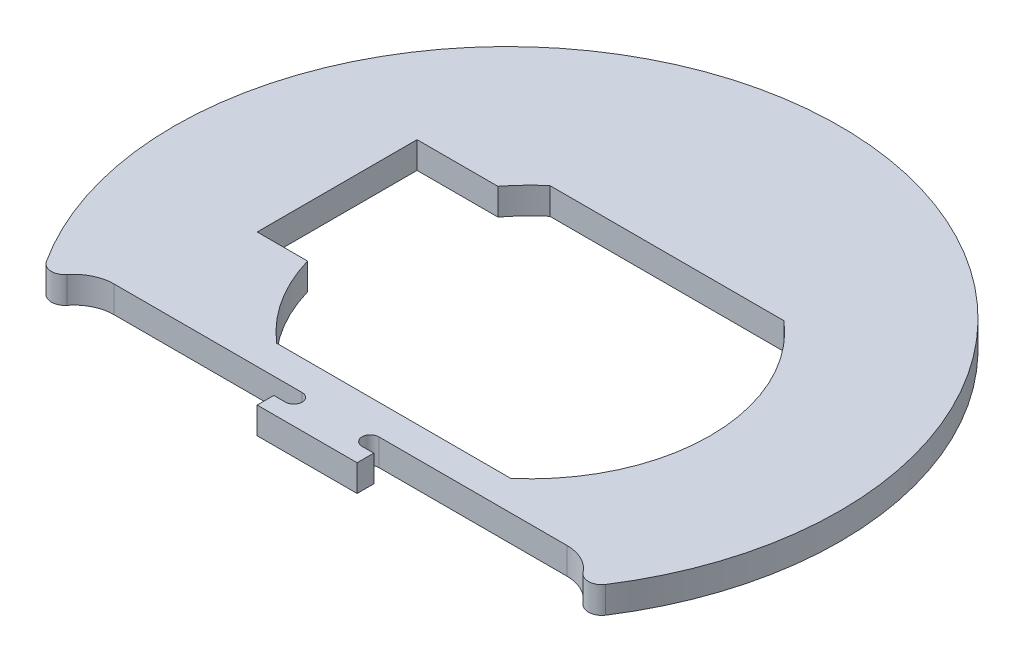
ISO-10303-21;
HEADER;
FILE_DESCRIPTION(('STEP AP214'),'2;1');
FILE_NAME('part.step','',(''),(''),'','','');
FILE_SCHEMA(('AUTOMOTIVE_DESIGN { 1 0 10303 214 1 1 1 1 }'));
ENDSEC;
DATA;
#1=APPLICATION_CONTEXT('core data for automotive mechanical design processes');
#2=APPLICATION_PROTOCOL_DEFINITION('international standard','automotive_design',2000,#1);
#3=PRODUCT_CONTEXT('',#1,'mechanical');
#4=PRODUCT('Part','Part','',(#3));
#5=PRODUCT_RELATED_PRODUCT_CATEGORY('part','',(#4));
#6=PRODUCT_DEFINITION_FORMATION('','',#4);
#7=PRODUCT_DEFINITION_CONTEXT('part definition',#1,'design');
#8=PRODUCT_DEFINITION('design','',#6,#7);
#9=PRODUCT_DEFINITION_SHAPE('','',#8);
#10=(LENGTH_UNIT() NAMED_UNIT(*) SI_UNIT(.MILLI.,.METRE.));
#11=(NAMED_UNIT(*) PLANE_ANGLE_UNIT() SI_UNIT($,.RADIAN.));
#12=(NAMED_UNIT(*) SI_UNIT($,.STERADIAN.) SOLID_ANGLE_UNIT());
#13=UNCERTAINTY_MEASURE_WITH_UNIT(LENGTH_MEASURE(1.E-05),#10,'distance_accuracy_value','');
#14=(GEOMETRIC_REPRESENTATION_CONTEXT(3) GLOBAL_UNCERTAINTY_ASSIGNED_CONTEXT((#13)) GLOBAL_UNIT_ASSIGNED_CONTEXT((#10,
#11,#12)) REPRESENTATION_CONTEXT('',''));
#15=CARTESIAN_POINT('',(0.,0.,0.));
#16=DIRECTION('',(0.,0.,1.));
#17=DIRECTION('',(1.,0.,0.));
#18=AXIS2_PLACEMENT_3D('',#15,#16,#17);
#19=CARTESIAN_POINT('',(5.75000000000001,2.,26.25));
#20=DIRECTION('',(0.,-1.,0.));
#21=DIRECTION('',(0.,0.,-1.));
#22=AXIS2_PLACEMENT_3D('',#19,#20,#21);
#23=PLANE('',#22);
#24=DIRECTION('',(0.,0.,-1.));
#25=VECTOR('',#24,1.);
#26=CARTESIAN_POINT('',(7.5,2.,30.));
#27=LINE('',#26,#25);
#28=CARTESIAN_POINT('',(7.5,2.,30.));
#29=VERTEX_POINT('',#28);
#30=CARTESIAN_POINT('',(7.5,2.,27.5));
#31=VERTEX_POINT('',#30);
#32=EDGE_CURVE('E278',#29,#31,#27,.T.);
#33=ORIENTED_EDGE('',*,*,#32,.T.);
#34=DIRECTION('',(-1.,0.,0.));
#35=VECTOR('',#34,1.);
#36=CARTESIAN_POINT('',(7.5,2.,27.5));
#37=LINE('',#36,#35);
#38=CARTESIAN_POINT('',(5.75000000000001,2.,27.5));
#39=VERTEX_POINT('',#38);
#40=EDGE_CURVE('E282',#31,#39,#37,.T.);
#41=ORIENTED_EDGE('',*,*,#40,.T.);
#42=CARTESIAN_POINT('',(5.75000000000001,2.,26.25));
#43=DIRECTION('',(0.,-1.,0.));
#44=DIRECTION('',(0.,0.,-1.));
#45=AXIS2_PLACEMENT_3D('',#42,#43,#44);
#46=CIRCLE('',#45,1.25);
#47=CARTESIAN_POINT('',(5.75000000000001,2.,25.));
#48=VERTEX_POINT('',#47);
#49=EDGE_CURVE('E286',#39,#48,#46,.T.);
#50=ORIENTED_EDGE('',*,*,#49,.T.);
#51=DIRECTION('',(1.,0.,0.));
#52=VECTOR('',#51,1.);
#53=CARTESIAN_POINT('',(5.75000000000001,2.,25.));
#54=LINE('',#53,#52);
#55=CARTESIAN_POINT('',(34.,2.,25.));
#56=VERTEX_POINT('',#55);
#57=EDGE_CURVE('E289',#48,#56,#54,.T.);
#58=ORIENTED_EDGE('',*,*,#57,.T.);
#59=CARTESIAN_POINT('',(34.,2.,31.));
#60=DIRECTION('',(0.,-1.,0.));
#61=DIRECTION('',(0.,0.,-1.));
#62=AXIS2_PLACEMENT_3D('',#59,#60,#61);
#63=CIRCLE('',#62,6.);
#64=CARTESIAN_POINT('',(38.7264875714163,2.,27.3040136313499));
#65=VERTEX_POINT('',#64);
#66=EDGE_CURVE('E292',#56,#65,#63,.T.);
#67=ORIENTED_EDGE('',*,*,#66,.T.);
#68=CARTESIAN_POINT('',(40.3019834285551,2.,26.0720181751332));
#69=DIRECTION('',(0.,1.,0.));
#70=DIRECTION('',(0.,0.,1.));
#71=AXIS2_PLACEMENT_3D('',#68,#69,#70);
#72=CIRCLE('',#71,2.);
#73=CARTESIAN_POINT('',(41.9812327380782,2.,27.1583522657637));
#74=VERTEX_POINT('',#73);
#75=EDGE_CURVE('E295',#65,#74,#72,.T.);
#76=ORIENTED_EDGE('',*,*,#75,.T.);
#77=CARTESIAN_POINT('',(0.,2.,0.));
#78=DIRECTION('',(0.,1.,0.));
#79=DIRECTION('',(0.,0.,1.));
#80=AXIS2_PLACEMENT_3D('',#77,#78,#79);
#81=CIRCLE('',#80,50.);
#82=CARTESIAN_POINT('',(-41.9812327380782,2.,27.1583522657637));
#83=VERTEX_POINT('',#82);
#84=EDGE_CURVE('E298',#74,#83,#81,.T.);
#85=ORIENTED_EDGE('',*,*,#84,.T.);
#86=CARTESIAN_POINT('',(-40.3019834285551,2.,26.0720181751332));
#87=DIRECTION('',(0.,1.,0.));
#88=DIRECTION('',(0.,0.,-1.));
#89=AXIS2_PLACEMENT_3D('',#86,#87,#88);
#90=CIRCLE('',#89,2.);
#91=CARTESIAN_POINT('',(-38.7264875714163,2.,27.3040136313499));
#92=VERTEX_POINT('',#91);
#93=EDGE_CURVE('E301',#83,#92,#90,.T.);
#94=ORIENTED_EDGE('',*,*,#93,.T.);
#95=CARTESIAN_POINT('',(-34.,2.,31.));
#96=DIRECTION('',(0.,-1.,0.));
#97=DIRECTION('',(0.,0.,1.));
#98=AXIS2_PLACEMENT_3D('',#95,#96,#97);
#99=CIRCLE('',#98,6.);
#100=CARTESIAN_POINT('',(-34.,2.,25.));
#101=VERTEX_POINT('',#100);
#102=EDGE_CURVE('E304',#92,#101,#99,.T.);
#103=ORIENTED_EDGE('',*,*,#102,.T.);
#104=DIRECTION('',(1.,0.,0.));
#105=VECTOR('',#104,1.);
#106=CARTESIAN_POINT('',(-5.75,2.,25.));
#107=LINE('',#106,#105);
#108=CARTESIAN_POINT('',(-5.75,2.,25.));
#109=VERTEX_POINT('',#108);
#110=EDGE_CURVE('E307',#101,#109,#107,.T.);
#111=ORIENTED_EDGE('',*,*,#110,.T.);
#112=CARTESIAN_POINT('',(-5.75,2.,26.25));
#113=DIRECTION('',(0.,-1.,0.));
#114=DIRECTION('',(0.,0.,1.));
#115=AXIS2_PLACEMENT_3D('',#112,#113,#114);
#116=CIRCLE('',#115,1.25);
#117=CARTESIAN_POINT('',(-5.75,2.,27.5));
#118=VERTEX_POINT('',#117);
#119=EDGE_CURVE('E310',#109,#118,#116,.T.);
#120=ORIENTED_EDGE('',*,*,#119,.T.);
#121=DIRECTION('',(-1.,0.,0.));
#122=VECTOR('',#121,1.);
#123=CARTESIAN_POINT('',(-7.49999999999999,2.,27.5));
#124=LINE('',#123,#122);
#125=CARTESIAN_POINT('',(-7.49999999999999,2.,27.5));
#126=VERTEX_POINT('',#125);
#127=EDGE_CURVE('E313',#118,#126,#124,.T.);
#128=ORIENTED_EDGE('',*,*,#127,.T.);
#129=DIRECTION('',(0.,0.,1.));
#130=VECTOR('',#129,1.);
#131=CARTESIAN_POINT('',(-7.5,2.,30.));
#132=LINE('',#131,#130);
#133=CARTESIAN_POINT('',(-7.5,2.,30.));
#134=VERTEX_POINT('',#133);
#135=EDGE_CURVE('E316',#126,#134,#132,.T.);
#136=ORIENTED_EDGE('',*,*,#135,.T.);
#137=DIRECTION('',(1.,0.,0.));
#138=VECTOR('',#137,1.);
#139=CARTESIAN_POINT('',(7.5,2.,30.));
#140=LINE('',#139,#138);
#141=EDGE_CURVE('E319',#134,#29,#140,.T.);
#142=ORIENTED_EDGE('',*,*,#141,.T.);
#143=EDGE_LOOP('',(#33,#41,#50,#58,#67,#76,#85,#94,#103,#111,#120,#128,#136,#142));
#144=FACE_BOUND('',#143,.T.);
#145=CARTESIAN_POINT('',(3.5,2.,0.));
#146=DIRECTION('',(0.,1.,0.));
#147=DIRECTION('',(0.,0.,1.));
#148=AXIS2_PLACEMENT_3D('',#145,#146,#147);
#149=CIRCLE('',#148,27.);
#150=CARTESIAN_POINT('',(-22.4374246986859,2.,7.5));
#151=VERTEX_POINT('',#150);
#152=CARTESIAN_POINT('',(-14.0712833908056,2.,20.5));
#153=VERTEX_POINT('',#152);
#154=EDGE_CURVE('E189',#151,#153,#149,.T.);
#155=ORIENTED_EDGE('',*,*,#154,.F.);
#156=DIRECTION('',(1.,0.,0.));
#157=VECTOR('',#156,1.);
#158=CARTESIAN_POINT('',(-30.,2.,7.5));
#159=LINE('',#158,#157);
#160=CARTESIAN_POINT('',(-30.,2.,7.5));
#161=VERTEX_POINT('',#160);
#162=EDGE_CURVE('E230',#161,#151,#159,.T.);
#163=ORIENTED_EDGE('',*,*,#162,.F.);
#164=DIRECTION('',(0.,0.,1.));
#165=VECTOR('',#164,1.);
#166=CARTESIAN_POINT('',(-30.,2.,-16.5));
#167=LINE('',#166,#165);
#168=CARTESIAN_POINT('',(-30.,2.,-16.5));
#169=VERTEX_POINT('',#168);
#170=EDGE_CURVE('E227',#169,#161,#167,.T.);
#171=ORIENTED_EDGE('',*,*,#170,.F.);
#172=DIRECTION('',(-1.,0.,0.));
#173=VECTOR('',#172,1.);
#174=CARTESIAN_POINT('',(-17.8717102731625,2.,-16.5));
#175=LINE('',#174,#173);
#176=CARTESIAN_POINT('',(-17.8717102731625,2.,-16.5));
#177=VERTEX_POINT('',#176);
#178=EDGE_CURVE('E224',#177,#169,#175,.T.);
#179=ORIENTED_EDGE('',*,*,#178,.F.);
#180=CARTESIAN_POINT('',(3.5,2.,0.));
#181=DIRECTION('',(0.,1.,0.));
#182=DIRECTION('',(0.,0.,1.));
#183=AXIS2_PLACEMENT_3D('',#180,#181,#182);
#184=CIRCLE('',#183,27.);
#185=CARTESIAN_POINT('',(-14.0712833908056,2.,-20.5));
#186=VERTEX_POINT('',#185);
#187=EDGE_CURVE('E221',#186,#177,#184,.T.);
#188=ORIENTED_EDGE('',*,*,#187,.F.);
#189=DIRECTION('',(-1.,0.,0.));
#190=VECTOR('',#189,1.);
#191=CARTESIAN_POINT('',(21.0712833908056,2.,-20.5));
#192=LINE('',#191,#190);
#193=CARTESIAN_POINT('',(21.0712833908056,2.,-20.5));
#194=VERTEX_POINT('',#193);
#195=EDGE_CURVE('E216',#194,#186,#192,.T.);
#196=ORIENTED_EDGE('',*,*,#195,.F.);
#197=CARTESIAN_POINT('',(3.5,2.,0.));
#198=DIRECTION('',(0.,1.,0.));
#199=DIRECTION('',(0.,0.,1.));
#200=AXIS2_PLACEMENT_3D('',#197,#198,#199);
#201=CIRCLE('',#200,27.);
#202=CARTESIAN_POINT('',(21.0712833908056,2.,20.5));
#203=VERTEX_POINT('',#202);
#204=EDGE_CURVE('E212',#203,#194,#201,.T.);
#205=ORIENTED_EDGE('',*,*,#204,.F.);
#206=DIRECTION('',(1.,0.,0.));
#207=VECTOR('',#206,1.);
#208=CARTESIAN_POINT('',(21.0712833908056,2.,20.5));
#209=LINE('',#208,#207);
#210=EDGE_CURVE('E198',#153,#203,#209,.T.);
#211=ORIENTED_EDGE('',*,*,#210,.F.);
#212=EDGE_LOOP('',(#155,#163,#171,#179,#188,#196,#205,#211));
#213=FACE_BOUND('',#212,.T.);
#214=ADVANCED_FACE('F39',(#144,#213),#23,.F.);
#215=CARTESIAN_POINT('',(5.75000000000001,-2.,26.25));
#216=DIRECTION('',(0.,-1.,0.));
#217=DIRECTION('',(0.,0.,-1.));
#218=AXIS2_PLACEMENT_3D('',#215,#216,#217);
#219=PLANE('',#218);
#220=DIRECTION('',(0.,0.,-1.));
#221=VECTOR('',#220,1.);
#222=CARTESIAN_POINT('',(7.5,-2.,30.));
#223=LINE('',#222,#221);
#224=CARTESIAN_POINT('',(7.5,-2.,30.));
#225=VERTEX_POINT('',#224);
#226=CARTESIAN_POINT('',(7.5,-2.,27.5));
#227=VERTEX_POINT('',#226);
#228=EDGE_CURVE('E207',#225,#227,#223,.T.);
#229=ORIENTED_EDGE('',*,*,#228,.F.);
#230=DIRECTION('',(1.,0.,0.));
#231=VECTOR('',#230,1.);
#232=CARTESIAN_POINT('',(7.5,-2.,30.));
#233=LINE('',#232,#231);
#234=CARTESIAN_POINT('',(-7.5,-2.,30.));
#235=VERTEX_POINT('',#234);
#236=EDGE_CURVE('E283',#235,#225,#233,.T.);
#237=ORIENTED_EDGE('',*,*,#236,.F.);
#238=DIRECTION('',(0.,0.,1.));
#239=VECTOR('',#238,1.);
#240=CARTESIAN_POINT('',(-7.5,-2.,30.));
#241=LINE('',#240,#239);
#242=CARTESIAN_POINT('',(-7.49999999999999,-2.,27.5));
#243=VERTEX_POINT('',#242);
#244=EDGE_CURVE('E359',#243,#235,#241,.T.);
#245=ORIENTED_EDGE('',*,*,#244,.F.);
#246=DIRECTION('',(-1.,0.,0.));
#247=VECTOR('',#246,1.);
#248=CARTESIAN_POINT('',(-7.49999999999999,-2.,27.5));
#249=LINE('',#248,#247);
#250=CARTESIAN_POINT('',(-5.75,-2.,27.5));
#251=VERTEX_POINT('',#250);
#252=EDGE_CURVE('E356',#251,#243,#249,.T.);
#253=ORIENTED_EDGE('',*,*,#252,.F.);
#254=CARTESIAN_POINT('',(-5.75,-2.,26.25));
#255=DIRECTION('',(0.,-1.,0.));
#256=DIRECTION('',(0.,0.,1.));
#257=AXIS2_PLACEMENT_3D('',#254,#255,#256);
#258=CIRCLE('',#257,1.25);
#259=CARTESIAN_POINT('',(-5.75,-2.,25.));
#260=VERTEX_POINT('',#259);
#261=EDGE_CURVE('E353',#260,#251,#258,.T.);
#262=ORIENTED_EDGE('',*,*,#261,.F.);
#263=DIRECTION('',(1.,0.,0.));
#264=VECTOR('',#263,1.);
#265=CARTESIAN_POINT('',(-5.75,-2.,25.));
#266=LINE('',#265,#264);
#267=CARTESIAN_POINT('',(-34.,-2.,25.));
#268=VERTEX_POINT('',#267);
#269=EDGE_CURVE('E350',#268,#260,#266,.T.);
#270=ORIENTED_EDGE('',*,*,#269,.F.);
#271=CARTESIAN_POINT('',(-34.,-2.,31.));
#272=DIRECTION('',(0.,-1.,0.));
#273=DIRECTION('',(0.,0.,1.));
#274=AXIS2_PLACEMENT_3D('',#271,#272,#273);
#275=CIRCLE('',#274,6.);
#276=CARTESIAN_POINT('',(-38.7264875714163,-2.,27.3040136313499));
#277=VERTEX_POINT('',#276);
#278=EDGE_CURVE('E347',#277,#268,#275,.T.);
#279=ORIENTED_EDGE('',*,*,#278,.F.);
#280=CARTESIAN_POINT('',(-40.3019834285551,-2.,26.0720181751332));
#281=DIRECTION('',(0.,1.,0.));
#282=DIRECTION('',(0.,0.,-1.));
#283=AXIS2_PLACEMENT_3D('',#280,#281,#282);
#284=CIRCLE('',#283,2.);
#285=CARTESIAN_POINT('',(-41.9812327380782,-2.,27.1583522657637));
#286=VERTEX_POINT('',#285);
#287=EDGE_CURVE('E344',#286,#277,#284,.T.);
#288=ORIENTED_EDGE('',*,*,#287,.F.);
#289=CARTESIAN_POINT('',(0.,-2.,0.));
#290=DIRECTION('',(0.,1.,0.));
#291=DIRECTION('',(0.,0.,1.));
#292=AXIS2_PLACEMENT_3D('',#289,#290,#291);
#293=CIRCLE('',#292,50.);
#294=CARTESIAN_POINT('',(41.9812327380782,-2.,27.1583522657637));
#295=VERTEX_POINT('',#294);
#296=EDGE_CURVE('E341',#295,#286,#293,.T.);
#297=ORIENTED_EDGE('',*,*,#296,.F.);
#298=CARTESIAN_POINT('',(40.3019834285551,-2.,26.0720181751332));
#299=DIRECTION('',(0.,1.,0.));
#300=DIRECTION('',(0.,0.,1.));
#301=AXIS2_PLACEMENT_3D('',#298,#299,#300);
#302=CIRCLE('',#301,2.);
#303=CARTESIAN_POINT('',(38.7264875714163,-2.,27.3040136313499));
#304=VERTEX_POINT('',#303);
#305=EDGE_CURVE('E338',#304,#295,#302,.T.);
#306=ORIENTED_EDGE('',*,*,#305,.F.);
#307=CARTESIAN_POINT('',(34.,-2.,31.));
#308=DIRECTION('',(0.,-1.,0.));
#309=DIRECTION('',(0.,0.,-1.));
#310=AXIS2_PLACEMENT_3D('',#307,#308,#309);
#311=CIRCLE('',#310,6.);
#312=CARTESIAN_POINT('',(34.,-2.,25.));
#313=VERTEX_POINT('',#312);
#314=EDGE_CURVE('E335',#313,#304,#311,.T.);
#315=ORIENTED_EDGE('',*,*,#314,.F.);
#316=DIRECTION('',(1.,0.,0.));
#317=VECTOR('',#316,1.);
#318=CARTESIAN_POINT('',(5.75000000000001,-2.,25.));
#319=LINE('',#318,#317);
#320=CARTESIAN_POINT('',(5.75000000000001,-2.,25.));
#321=VERTEX_POINT('',#320);
#322=EDGE_CURVE('E332',#321,#313,#319,.T.);
#323=ORIENTED_EDGE('',*,*,#322,.F.);
#324=CARTESIAN_POINT('',(5.75000000000001,-2.,26.25));
#325=DIRECTION('',(0.,-1.,0.));
#326=DIRECTION('',(0.,0.,-1.));
#327=AXIS2_PLACEMENT_3D('',#324,#325,#326);
#328=CIRCLE('',#327,1.25);
#329=CARTESIAN_POINT('',(5.75000000000001,-2.,27.5));
#330=VERTEX_POINT('',#329);
#331=EDGE_CURVE('E329',#330,#321,#328,.T.);
#332=ORIENTED_EDGE('',*,*,#331,.F.);
#333=DIRECTION('',(-1.,0.,0.));
#334=VECTOR('',#333,1.);
#335=CARTESIAN_POINT('',(7.5,-2.,27.5));
#336=LINE('',#335,#334);
#337=EDGE_CURVE('E326',#227,#330,#336,.T.);
#338=ORIENTED_EDGE('',*,*,#337,.F.);
#339=EDGE_LOOP('',(#229,#237,#245,#253,#262,#270,#279,#288,#297,#306,#315,#323,#332,#338));
#340=FACE_BOUND('',#339,.T.);
#341=DIRECTION('',(1.,0.,0.));
#342=VECTOR('',#341,1.);
#343=CARTESIAN_POINT('',(-30.,-2.,7.5));
#344=LINE('',#343,#342);
#345=CARTESIAN_POINT('',(-30.,-2.,7.5));
#346=VERTEX_POINT('',#345);
#347=CARTESIAN_POINT('',(-22.4374246986859,-2.,7.5));
#348=VERTEX_POINT('',#347);
#349=EDGE_CURVE('E199',#346,#348,#344,.T.);
#350=ORIENTED_EDGE('',*,*,#349,.T.);
#351=CARTESIAN_POINT('',(3.5,-2.,0.));
#352=DIRECTION('',(0.,1.,0.));
#353=DIRECTION('',(0.,0.,1.));
#354=AXIS2_PLACEMENT_3D('',#351,#352,#353);
#355=CIRCLE('',#354,27.);
#356=CARTESIAN_POINT('',(-14.0712833908056,-2.,20.5));
#357=VERTEX_POINT('',#356);
#358=EDGE_CURVE('E63',#348,#357,#355,.T.);
#359=ORIENTED_EDGE('',*,*,#358,.T.);
#360=DIRECTION('',(1.,0.,0.));
#361=VECTOR('',#360,1.);
#362=CARTESIAN_POINT('',(21.0712833908056,-2.,20.5));
#363=LINE('',#362,#361);
#364=CARTESIAN_POINT('',(21.0712833908056,-2.,20.5));
#365=VERTEX_POINT('',#364);
#366=EDGE_CURVE('E205',#357,#365,#363,.T.);
#367=ORIENTED_EDGE('',*,*,#366,.T.);
#368=CARTESIAN_POINT('',(3.5,-2.,0.));
#369=DIRECTION('',(0.,1.,0.));
#370=DIRECTION('',(0.,0.,1.));
#371=AXIS2_PLACEMENT_3D('',#368,#369,#370);
#372=CIRCLE('',#371,27.);
#373=CARTESIAN_POINT('',(21.0712833908056,-2.,-20.5));
#374=VERTEX_POINT('',#373);
#375=EDGE_CURVE('E237',#365,#374,#372,.T.);
#376=ORIENTED_EDGE('',*,*,#375,.T.);
#377=DIRECTION('',(-1.,0.,0.));
#378=VECTOR('',#377,1.);
#379=CARTESIAN_POINT('',(21.0712833908056,-2.,-20.5));
#380=LINE('',#379,#378);
#381=CARTESIAN_POINT('',(-14.0712833908056,-2.,-20.5));
#382=VERTEX_POINT('',#381);
#383=EDGE_CURVE('E241',#374,#382,#380,.T.);
#384=ORIENTED_EDGE('',*,*,#383,.T.);
#385=CARTESIAN_POINT('',(3.5,-2.,0.));
#386=DIRECTION('',(0.,1.,0.));
#387=DIRECTION('',(0.,0.,1.));
#388=AXIS2_PLACEMENT_3D('',#385,#386,#387);
#389=CIRCLE('',#388,27.);
#390=CARTESIAN_POINT('',(-17.8717102731625,-2.,-16.5));
#391=VERTEX_POINT('',#390);
#392=EDGE_CURVE('E245',#382,#391,#389,.T.);
#393=ORIENTED_EDGE('',*,*,#392,.T.);
#394=DIRECTION('',(-1.,0.,0.));
#395=VECTOR('',#394,1.);
#396=CARTESIAN_POINT('',(-17.8717102731625,-2.,-16.5));
#397=LINE('',#396,#395);
#398=CARTESIAN_POINT('',(-30.,-2.,-16.5));
#399=VERTEX_POINT('',#398);
#400=EDGE_CURVE('E249',#391,#399,#397,.T.);
#401=ORIENTED_EDGE('',*,*,#400,.T.);
#402=DIRECTION('',(0.,0.,1.));
#403=VECTOR('',#402,1.);
#404=CARTESIAN_POINT('',(-30.,-2.,-16.5));
#405=LINE('',#404,#403);
#406=EDGE_CURVE('E253',#399,#346,#405,.T.);
#407=ORIENTED_EDGE('',*,*,#406,.T.);
#408=EDGE_LOOP('',(#350,#359,#367,#376,#384,#393,#401,#407));
#409=FACE_BOUND('',#408,.T.);
#410=ADVANCED_FACE('F422',(#340,#409),#219,.T.);
#411=CARTESIAN_POINT('',(7.5,2.,30.));
#412=DIRECTION('',(-1.,0.,0.));
#413=DIRECTION('',(0.,0.,1.));
#414=AXIS2_PLACEMENT_3D('',#411,#412,#413);
#415=PLANE('',#414);
#416=ORIENTED_EDGE('',*,*,#228,.T.);
#417=DIRECTION('',(0.,-1.,0.));
#418=VECTOR('',#417,1.);
#419=CARTESIAN_POINT('',(7.5,2.,27.5));
#420=LINE('',#419,#418);
#421=EDGE_CURVE('E11',#31,#227,#420,.T.);
#422=ORIENTED_EDGE('',*,*,#421,.F.);
#423=ORIENTED_EDGE('',*,*,#32,.F.);
#424=DIRECTION('',(0.,-1.,0.));
#425=VECTOR('',#424,1.);
#426=CARTESIAN_POINT('',(7.5,2.,30.));
#427=LINE('',#426,#425);
#428=EDGE_CURVE('E322',#29,#225,#427,.T.);
#429=ORIENTED_EDGE('',*,*,#428,.T.);
#430=EDGE_LOOP('',(#416,#422,#423,#429));
#431=FACE_BOUND('',#430,.T.);
#432=ADVANCED_FACE('F41',(#431),#415,.F.);
#433=CARTESIAN_POINT('',(7.5,2.,27.5));
#434=DIRECTION('',(0.,0.,1.));
#435=DIRECTION('',(1.,0.,0.));
#436=AXIS2_PLACEMENT_3D('',#433,#434,#435);
#437=PLANE('',#436);
#438=ORIENTED_EDGE('',*,*,#337,.T.);
#439=DIRECTION('',(0.,-1.,0.));
#440=VECTOR('',#439,1.);
#441=CARTESIAN_POINT('',(5.75000000000001,2.,27.5));
#442=LINE('',#441,#440);
#443=EDGE_CURVE('E48',#39,#330,#442,.T.);
#444=ORIENTED_EDGE('',*,*,#443,.F.);
#445=ORIENTED_EDGE('',*,*,#40,.F.);
#446=ORIENTED_EDGE('',*,*,#421,.T.);
#447=EDGE_LOOP('',(#438,#444,#445,#446));
#448=FACE_BOUND('',#447,.T.);
#449=ADVANCED_FACE('F439',(#448),#437,.F.);
#450=CARTESIAN_POINT('',(5.75000000000001,2.,26.25));
#451=DIRECTION('',(0.,-1.,0.));
#452=DIRECTION('',(0.,0.,-1.));
#453=AXIS2_PLACEMENT_3D('',#450,#451,#452);
#454=CYLINDRICAL_SURFACE('',#453,1.25);
#455=ORIENTED_EDGE('',*,*,#331,.T.);
#456=DIRECTION('',(0.,-1.,0.));
#457=VECTOR('',#456,1.);
#458=CARTESIAN_POINT('',(5.75000000000001,2.,25.));
#459=LINE('',#458,#457);
#460=EDGE_CURVE('E407',#48,#321,#459,.T.);
#461=ORIENTED_EDGE('',*,*,#460,.F.);
#462=ORIENTED_EDGE('',*,*,#49,.F.);
#463=ORIENTED_EDGE('',*,*,#443,.T.);
#464=EDGE_LOOP('',(#455,#461,#462,#463));
#465=FACE_BOUND('',#464,.T.);
#466=ADVANCED_FACE('F416',(#465),#454,.F.);
#467=CARTESIAN_POINT('',(5.75000000000001,2.,25.));
#468=DIRECTION('',(0.,0.,-1.));
#469=DIRECTION('',(-1.,0.,0.));
#470=AXIS2_PLACEMENT_3D('',#467,#468,#469);
#471=PLANE('',#470);
#472=ORIENTED_EDGE('',*,*,#322,.T.);
#473=DIRECTION('',(0.,-1.,0.));
#474=VECTOR('',#473,1.);
#475=CARTESIAN_POINT('',(34.,2.,25.));
#476=LINE('',#475,#474);
#477=EDGE_CURVE('E403',#56,#313,#476,.T.);
#478=ORIENTED_EDGE('',*,*,#477,.F.);
#479=ORIENTED_EDGE('',*,*,#57,.F.);
#480=ORIENTED_EDGE('',*,*,#460,.T.);
#481=EDGE_LOOP('',(#472,#478,#479,#480));
#482=FACE_BOUND('',#481,.T.);
#483=ADVANCED_FACE('F428',(#482),#471,.F.);
#484=CARTESIAN_POINT('',(34.,2.,31.));
#485=DIRECTION('',(0.,-1.,0.));
#486=DIRECTION('',(0.,0.,-1.));
#487=AXIS2_PLACEMENT_3D('',#484,#485,#486);
#488=CYLINDRICAL_SURFACE('',#487,6.);
#489=ORIENTED_EDGE('',*,*,#314,.T.);
#490=DIRECTION('',(0.,-1.,0.));
#491=VECTOR('',#490,1.);
#492=CARTESIAN_POINT('',(38.7264875714163,2.,27.3040136313499));
#493=LINE('',#492,#491);
#494=EDGE_CURVE('E399',#65,#304,#493,.T.);
#495=ORIENTED_EDGE('',*,*,#494,.F.);
#496=ORIENTED_EDGE('',*,*,#66,.F.);
#497=ORIENTED_EDGE('',*,*,#477,.T.);
#498=EDGE_LOOP('',(#489,#495,#496,#497));
#499=FACE_BOUND('',#498,.T.);
#500=ADVANCED_FACE('F432',(#499),#488,.F.);
#501=CARTESIAN_POINT('',(40.3019834285551,2.,26.0720181751332));
#502=DIRECTION('',(0.,-1.,0.));
#503=DIRECTION('',(0.,0.,-1.));
#504=AXIS2_PLACEMENT_3D('',#501,#502,#503);
#505=CYLINDRICAL_SURFACE('',#504,2.);
#506=ORIENTED_EDGE('',*,*,#305,.T.);
#507=DIRECTION('',(0.,-1.,0.));
#508=VECTOR('',#507,1.);
#509=CARTESIAN_POINT('',(41.9812327380782,2.,27.1583522657637));
#510=LINE('',#509,#508);
#511=EDGE_CURVE('E395',#74,#295,#510,.T.);
#512=ORIENTED_EDGE('',*,*,#511,.F.);
#513=ORIENTED_EDGE('',*,*,#75,.F.);
#514=ORIENTED_EDGE('',*,*,#494,.T.);
#515=EDGE_LOOP('',(#506,#512,#513,#514));
#516=FACE_BOUND('',#515,.T.);
#517=ADVANCED_FACE('F482',(#516),#505,.T.);
#518=CARTESIAN_POINT('',(0.,2.,0.));
#519=DIRECTION('',(0.,-1.,0.));
#520=DIRECTION('',(0.,0.,-1.));
#521=AXIS2_PLACEMENT_3D('',#518,#519,#520);
#522=CYLINDRICAL_SURFACE('',#521,50.);
#523=ORIENTED_EDGE('',*,*,#296,.T.);
#524=DIRECTION('',(0.,-1.,0.));
#525=VECTOR('',#524,1.);
#526=CARTESIAN_POINT('',(-41.9812327380782,2.,27.1583522657637));
#527=LINE('',#526,#525);
#528=EDGE_CURVE('E391',#83,#286,#527,.T.);
#529=ORIENTED_EDGE('',*,*,#528,.F.);
#530=ORIENTED_EDGE('',*,*,#84,.F.);
#531=ORIENTED_EDGE('',*,*,#511,.T.);
#532=EDGE_LOOP('',(#523,#529,#530,#531));
#533=FACE_BOUND('',#532,.T.);
#534=ADVANCED_FACE('F480',(#533),#522,.T.);
#535=CARTESIAN_POINT('',(-40.3019834285551,2.,26.0720181751332));
#536=DIRECTION('',(0.,-1.,0.));
#537=DIRECTION('',(0.,0.,-1.));
#538=AXIS2_PLACEMENT_3D('',#535,#536,#537);
#539=CYLINDRICAL_SURFACE('',#538,2.);
#540=ORIENTED_EDGE('',*,*,#287,.T.);
#541=DIRECTION('',(0.,-1.,0.));
#542=VECTOR('',#541,1.);
#543=CARTESIAN_POINT('',(-38.7264875714163,2.,27.3040136313499));
#544=LINE('',#543,#542);
#545=EDGE_CURVE('E387',#92,#277,#544,.T.);
#546=ORIENTED_EDGE('',*,*,#545,.F.);
#547=ORIENTED_EDGE('',*,*,#93,.F.);
#548=ORIENTED_EDGE('',*,*,#528,.T.);
#549=EDGE_LOOP('',(#540,#546,#547,#548));
#550=FACE_BOUND('',#549,.T.);
#551=ADVANCED_FACE('F475',(#550),#539,.T.);
#552=CARTESIAN_POINT('',(-34.,2.,31.));
#553=DIRECTION('',(0.,-1.,0.));
#554=DIRECTION('',(0.,0.,-1.));
#555=AXIS2_PLACEMENT_3D('',#552,#553,#554);
#556=CYLINDRICAL_SURFACE('',#555,6.);
#557=ORIENTED_EDGE('',*,*,#278,.T.);
#558=DIRECTION('',(0.,-1.,0.));
#559=VECTOR('',#558,1.);
#560=CARTESIAN_POINT('',(-34.,2.,25.));
#561=LINE('',#560,#559);
#562=EDGE_CURVE('E383',#101,#268,#561,.T.);
#563=ORIENTED_EDGE('',*,*,#562,.F.);
#564=ORIENTED_EDGE('',*,*,#102,.F.);
#565=ORIENTED_EDGE('',*,*,#545,.T.);
#566=EDGE_LOOP('',(#557,#563,#564,#565));
#567=FACE_BOUND('',#566,.T.);
#568=ADVANCED_FACE('F470',(#567),#556,.F.);
#569=CARTESIAN_POINT('',(-5.75,2.,25.));
#570=DIRECTION('',(0.,0.,-1.));
#571=DIRECTION('',(-1.,0.,0.));
#572=AXIS2_PLACEMENT_3D('',#569,#570,#571);
#573=PLANE('',#572);
#574=ORIENTED_EDGE('',*,*,#269,.T.);
#575=DIRECTION('',(0.,-1.,0.));
#576=VECTOR('',#575,1.);
#577=CARTESIAN_POINT('',(-5.75,2.,25.));
#578=LINE('',#577,#576);
#579=EDGE_CURVE('E379',#109,#260,#578,.T.);
#580=ORIENTED_EDGE('',*,*,#579,.F.);
#581=ORIENTED_EDGE('',*,*,#110,.F.);
#582=ORIENTED_EDGE('',*,*,#562,.T.);
#583=EDGE_LOOP('',(#574,#580,#581,#582));
#584=FACE_BOUND('',#583,.T.);
#585=ADVANCED_FACE('F466',(#584),#573,.F.);
#586=CARTESIAN_POINT('',(-5.75,2.,26.25));
#587=DIRECTION('',(0.,-1.,0.));
#588=DIRECTION('',(0.,0.,-1.));
#589=AXIS2_PLACEMENT_3D('',#586,#587,#588);
#590=CYLINDRICAL_SURFACE('',#589,1.25);
#591=ORIENTED_EDGE('',*,*,#261,.T.);
#592=DIRECTION('',(0.,-1.,0.));
#593=VECTOR('',#592,1.);
#594=CARTESIAN_POINT('',(-5.75,2.,27.5));
#595=LINE('',#594,#593);
#596=EDGE_CURVE('E375',#118,#251,#595,.T.);
#597=ORIENTED_EDGE('',*,*,#596,.F.);
#598=ORIENTED_EDGE('',*,*,#119,.F.);
#599=ORIENTED_EDGE('',*,*,#579,.T.);
#600=EDGE_LOOP('',(#591,#597,#598,#599));
#601=FACE_BOUND('',#600,.T.);
#602=ADVANCED_FACE('F461',(#601),#590,.F.);
#603=CARTESIAN_POINT('',(-7.49999999999999,2.,27.5));
#604=DIRECTION('',(0.,0.,1.));
#605=DIRECTION('',(1.,0.,0.));
#606=AXIS2_PLACEMENT_3D('',#603,#604,#605);
#607=PLANE('',#606);
#608=ORIENTED_EDGE('',*,*,#252,.T.);
#609=DIRECTION('',(0.,-1.,0.));
#610=VECTOR('',#609,1.);
#611=CARTESIAN_POINT('',(-7.49999999999999,2.,27.5));
#612=LINE('',#611,#610);
#613=EDGE_CURVE('E371',#126,#243,#612,.T.);
#614=ORIENTED_EDGE('',*,*,#613,.F.);
#615=ORIENTED_EDGE('',*,*,#127,.F.);
#616=ORIENTED_EDGE('',*,*,#596,.T.);
#617=EDGE_LOOP('',(#608,#614,#615,#616));
#618=FACE_BOUND('',#617,.T.);
#619=ADVANCED_FACE('F455',(#618),#607,.F.);
#620=CARTESIAN_POINT('',(-7.5,2.,30.));
#621=DIRECTION('',(1.,0.,0.));
#622=DIRECTION('',(0.,0.,-1.));
#623=AXIS2_PLACEMENT_3D('',#620,#621,#622);
#624=PLANE('',#623);
#625=ORIENTED_EDGE('',*,*,#244,.T.);
#626=DIRECTION('',(0.,-1.,0.));
#627=VECTOR('',#626,1.);
#628=CARTESIAN_POINT('',(-7.5,2.,30.));
#629=LINE('',#628,#627);
#630=EDGE_CURVE('E367',#134,#235,#629,.T.);
#631=ORIENTED_EDGE('',*,*,#630,.F.);
#632=ORIENTED_EDGE('',*,*,#135,.F.);
#633=ORIENTED_EDGE('',*,*,#613,.T.);
#634=EDGE_LOOP('',(#625,#631,#632,#633));
#635=FACE_BOUND('',#634,.T.);
#636=ADVANCED_FACE('F451',(#635),#624,.F.);
#637=CARTESIAN_POINT('',(7.5,2.,30.));
#638=DIRECTION('',(0.,0.,-1.));
#639=DIRECTION('',(-1.,0.,0.));
#640=AXIS2_PLACEMENT_3D('',#637,#638,#639);
#641=PLANE('',#640);
#642=ORIENTED_EDGE('',*,*,#236,.T.);
#643=ORIENTED_EDGE('',*,*,#428,.F.);
#644=ORIENTED_EDGE('',*,*,#141,.F.);
#645=ORIENTED_EDGE('',*,*,#630,.T.);
#646=EDGE_LOOP('',(#642,#643,#644,#645));
#647=FACE_BOUND('',#646,.T.);
#648=ADVANCED_FACE('F446',(#647),#641,.F.);
#649=CARTESIAN_POINT('',(3.5,2.,0.));
#650=DIRECTION('',(0.,-1.,0.));
#651=DIRECTION('',(0.,0.,-1.));
#652=AXIS2_PLACEMENT_3D('',#649,#650,#651);
#653=CYLINDRICAL_SURFACE('',#652,27.);
#654=ORIENTED_EDGE('',*,*,#358,.F.);
#655=DIRECTION('',(0.,-1.,0.));
#656=VECTOR('',#655,1.);
#657=CARTESIAN_POINT('',(-22.4374246986859,2.,7.5));
#658=LINE('',#657,#656);
#659=EDGE_CURVE('E193',#151,#348,#658,.T.);
#660=ORIENTED_EDGE('',*,*,#659,.F.);
#661=ORIENTED_EDGE('',*,*,#154,.T.);
#662=DIRECTION('',(0.,-1.,0.));
#663=VECTOR('',#662,1.);
#664=CARTESIAN_POINT('',(-14.0712833908056,2.,20.5));
#665=LINE('',#664,#663);
#666=EDGE_CURVE('E192',#153,#357,#665,.T.);
#667=ORIENTED_EDGE('',*,*,#666,.T.);
#668=EDGE_LOOP('',(#654,#660,#661,#667));
#669=FACE_BOUND('',#668,.T.);
#670=ADVANCED_FACE('F191',(#669),#653,.F.);
#671=CARTESIAN_POINT('',(21.0712833908056,2.,20.5));
#672=DIRECTION('',(0.,0.,-1.));
#673=DIRECTION('',(-1.,0.,0.));
#674=AXIS2_PLACEMENT_3D('',#671,#672,#673);
#675=PLANE('',#674);
#676=ORIENTED_EDGE('',*,*,#366,.F.);
#677=ORIENTED_EDGE('',*,*,#666,.F.);
#678=ORIENTED_EDGE('',*,*,#210,.T.);
#679=DIRECTION('',(0.,-1.,0.));
#680=VECTOR('',#679,1.);
#681=CARTESIAN_POINT('',(21.0712833908056,2.,20.5));
#682=LINE('',#681,#680);
#683=EDGE_CURVE('E208',#203,#365,#682,.T.);
#684=ORIENTED_EDGE('',*,*,#683,.T.);
#685=EDGE_LOOP('',(#676,#677,#678,#684));
#686=FACE_BOUND('',#685,.T.);
#687=ADVANCED_FACE('F202',(#686),#675,.T.);
#688=CARTESIAN_POINT('',(3.5,2.,0.));
#689=DIRECTION('',(0.,-1.,0.));
#690=DIRECTION('',(0.,0.,-1.));
#691=AXIS2_PLACEMENT_3D('',#688,#689,#690);
#692=CYLINDRICAL_SURFACE('',#691,27.);
#693=ORIENTED_EDGE('',*,*,#375,.F.);
#694=ORIENTED_EDGE('',*,*,#683,.F.);
#695=ORIENTED_EDGE('',*,*,#204,.T.);
#696=DIRECTION('',(0.,-1.,0.));
#697=VECTOR('',#696,1.);
#698=CARTESIAN_POINT('',(21.0712833908056,2.,-20.5));
#699=LINE('',#698,#697);
#700=EDGE_CURVE('E273',#194,#374,#699,.T.);
#701=ORIENTED_EDGE('',*,*,#700,.T.);
#702=EDGE_LOOP('',(#693,#694,#695,#701));
#703=FACE_BOUND('',#702,.T.);
#704=ADVANCED_FACE('F552',(#703),#692,.F.);
#705=CARTESIAN_POINT('',(21.0712833908056,2.,-20.5));
#706=DIRECTION('',(0.,0.,1.));
#707=DIRECTION('',(1.,0.,0.));
#708=AXIS2_PLACEMENT_3D('',#705,#706,#707);
#709=PLANE('',#708);
#710=ORIENTED_EDGE('',*,*,#383,.F.);
#711=ORIENTED_EDGE('',*,*,#700,.F.);
#712=ORIENTED_EDGE('',*,*,#195,.T.);
#713=DIRECTION('',(0.,-1.,0.));
#714=VECTOR('',#713,1.);
#715=CARTESIAN_POINT('',(-14.0712833908056,2.,-20.5));
#716=LINE('',#715,#714);
#717=EDGE_CURVE('E270',#186,#382,#716,.T.);
#718=ORIENTED_EDGE('',*,*,#717,.T.);
#719=EDGE_LOOP('',(#710,#711,#712,#718));
#720=FACE_BOUND('',#719,.T.);
#721=ADVANCED_FACE('F558',(#720),#709,.T.);
#722=CARTESIAN_POINT('',(3.5,2.,0.));
#723=DIRECTION('',(0.,-1.,0.));
#724=DIRECTION('',(0.,0.,-1.));
#725=AXIS2_PLACEMENT_3D('',#722,#723,#724);
#726=CYLINDRICAL_SURFACE('',#725,27.);
#727=ORIENTED_EDGE('',*,*,#392,.F.);
#728=ORIENTED_EDGE('',*,*,#717,.F.);
#729=ORIENTED_EDGE('',*,*,#187,.T.);
#730=DIRECTION('',(0.,-1.,0.));
#731=VECTOR('',#730,1.);
#732=CARTESIAN_POINT('',(-17.8717102731625,2.,-16.5));
#733=LINE('',#732,#731);
#734=EDGE_CURVE('E267',#177,#391,#733,.T.);
#735=ORIENTED_EDGE('',*,*,#734,.T.);
#736=EDGE_LOOP('',(#727,#728,#729,#735));
#737=FACE_BOUND('',#736,.T.);
#738=ADVANCED_FACE('F566',(#737),#726,.F.);
#739=CARTESIAN_POINT('',(-17.8717102731625,2.,-16.5));
#740=DIRECTION('',(0.,0.,1.));
#741=DIRECTION('',(1.,0.,0.));
#742=AXIS2_PLACEMENT_3D('',#739,#740,#741);
#743=PLANE('',#742);
#744=ORIENTED_EDGE('',*,*,#400,.F.);
#745=ORIENTED_EDGE('',*,*,#734,.F.);
#746=ORIENTED_EDGE('',*,*,#178,.T.);
#747=DIRECTION('',(0.,-1.,0.));
#748=VECTOR('',#747,1.);
#749=CARTESIAN_POINT('',(-30.,2.,-16.5));
#750=LINE('',#749,#748);
#751=EDGE_CURVE('E264',#169,#399,#750,.T.);
#752=ORIENTED_EDGE('',*,*,#751,.T.);
#753=EDGE_LOOP('',(#744,#745,#746,#752));
#754=FACE_BOUND('',#753,.T.);
#755=ADVANCED_FACE('F574',(#754),#743,.T.);
#756=CARTESIAN_POINT('',(-30.,2.,-16.5));
#757=DIRECTION('',(1.,0.,0.));
#758=DIRECTION('',(0.,0.,-1.));
#759=AXIS2_PLACEMENT_3D('',#756,#757,#758);
#760=PLANE('',#759);
#761=ORIENTED_EDGE('',*,*,#406,.F.);
#762=ORIENTED_EDGE('',*,*,#751,.F.);
#763=ORIENTED_EDGE('',*,*,#170,.T.);
#764=DIRECTION('',(0.,-1.,0.));
#765=VECTOR('',#764,1.);
#766=CARTESIAN_POINT('',(-30.,2.,7.5));
#767=LINE('',#766,#765);
#768=EDGE_CURVE('E55',#161,#346,#767,.T.);
#769=ORIENTED_EDGE('',*,*,#768,.T.);
#770=EDGE_LOOP('',(#761,#762,#763,#769));
#771=FACE_BOUND('',#770,.T.);
#772=ADVANCED_FACE('F582',(#771),#760,.T.);
#773=CARTESIAN_POINT('',(-30.,2.,7.5));
#774=DIRECTION('',(0.,0.,-1.));
#775=DIRECTION('',(-1.,0.,0.));
#776=AXIS2_PLACEMENT_3D('',#773,#774,#775);
#777=PLANE('',#776);
#778=ORIENTED_EDGE('',*,*,#349,.F.);
#779=ORIENTED_EDGE('',*,*,#768,.F.);
#780=ORIENTED_EDGE('',*,*,#162,.T.);
#781=ORIENTED_EDGE('',*,*,#659,.T.);
#782=EDGE_LOOP('',(#778,#779,#780,#781));
#783=FACE_BOUND('',#782,.T.);
#784=ADVANCED_FACE('F590',(#783),#777,.T.);
#785=CLOSED_SHELL('',(#214,#410,#432,#449,#466,#483,#500,#517,#534,#551,#568,#585,#602,#619,
#636,#648,#670,#687,#704,#721,#738,#755,#772,#784));
#786=MANIFOLD_SOLID_BREP('B2',#785);
#787=ADVANCED_BREP_SHAPE_REPRESENTATION('',(#18,#786),#14);
#788=SHAPE_DEFINITION_REPRESENTATION(#9,#787);
ENDSEC;
END-ISO-10303-21;
